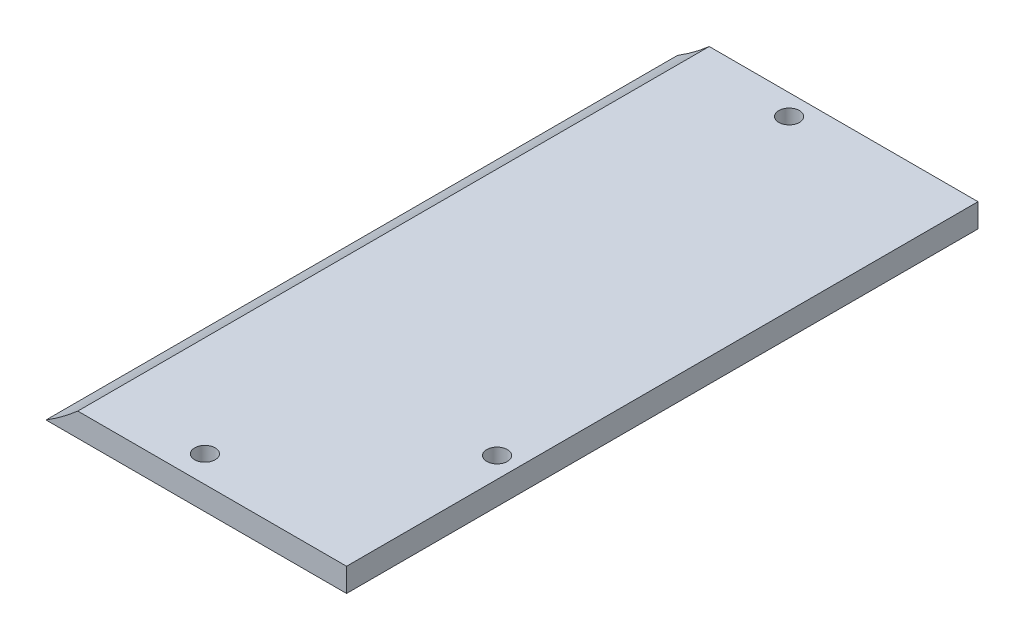
ISO-10303-21;
HEADER;
FILE_DESCRIPTION(('STEP AP214'),'2;1');
FILE_NAME('part.step','',(''),(''),'','','');
FILE_SCHEMA(('AUTOMOTIVE_DESIGN { 1 0 10303 214 1 1 1 1 }'));
ENDSEC;
DATA;
#1=APPLICATION_CONTEXT('core data for automotive mechanical design processes');
#2=APPLICATION_PROTOCOL_DEFINITION('international standard','automotive_design',2000,#1);
#3=PRODUCT_CONTEXT('',#1,'mechanical');
#4=PRODUCT('Part','Part','',(#3));
#5=PRODUCT_RELATED_PRODUCT_CATEGORY('part','',(#4));
#6=PRODUCT_DEFINITION_FORMATION('','',#4);
#7=PRODUCT_DEFINITION_CONTEXT('part definition',#1,'design');
#8=PRODUCT_DEFINITION('design','',#6,#7);
#9=PRODUCT_DEFINITION_SHAPE('','',#8);
#10=(LENGTH_UNIT() NAMED_UNIT(*) SI_UNIT(.MILLI.,.METRE.));
#11=(NAMED_UNIT(*) PLANE_ANGLE_UNIT() SI_UNIT($,.RADIAN.));
#12=(NAMED_UNIT(*) SI_UNIT($,.STERADIAN.) SOLID_ANGLE_UNIT());
#13=UNCERTAINTY_MEASURE_WITH_UNIT(LENGTH_MEASURE(1.E-05),#10,'distance_accuracy_value','');
#14=(GEOMETRIC_REPRESENTATION_CONTEXT(3) GLOBAL_UNCERTAINTY_ASSIGNED_CONTEXT((#13)) GLOBAL_UNIT_ASSIGNED_CONTEXT((#10,
#11,#12)) REPRESENTATION_CONTEXT('',''));
#15=CARTESIAN_POINT('',(0.,0.,0.));
#16=DIRECTION('',(0.,0.,1.));
#17=DIRECTION('',(1.,0.,0.));
#18=AXIS2_PLACEMENT_3D('',#15,#16,#17);
#19=CARTESIAN_POINT('',(21.0713075057055,-34.,107.));
#20=DIRECTION('',(0.,-1.,0.));
#21=DIRECTION('',(1.,0.,0.));
#22=AXIS2_PLACEMENT_3D('',#19,#20,#21);
#23=PLANE('',#22);
#24=CARTESIAN_POINT('',(68.5,-34.,78.));
#25=DIRECTION('',(0.,-1.,0.));
#26=DIRECTION('',(1.,0.,0.));
#27=AXIS2_PLACEMENT_3D('',#24,#25,#26);
#28=CIRCLE('',#27,1.75000000000001);
#29=CARTESIAN_POINT('',(70.25,-34.,78.));
#30=VERTEX_POINT('',#29);
#31=EDGE_CURVE('E113',#30,#30,#28,.T.);
#32=ORIENTED_EDGE('',*,*,#31,.F.);
#33=EDGE_LOOP('',(#32));
#34=FACE_BOUND('',#33,.T.);
#35=CARTESIAN_POINT('',(43.5,-34.,3.50000000000001));
#36=DIRECTION('',(0.,-1.,0.));
#37=DIRECTION('',(1.,0.,0.));
#38=AXIS2_PLACEMENT_3D('',#35,#36,#37);
#39=CIRCLE('',#38,1.75);
#40=CARTESIAN_POINT('',(45.25,-34.,3.50000000000001));
#41=VERTEX_POINT('',#40);
#42=EDGE_CURVE('E107',#41,#41,#39,.T.);
#43=ORIENTED_EDGE('',*,*,#42,.F.);
#44=EDGE_LOOP('',(#43));
#45=FACE_BOUND('',#44,.T.);
#46=CARTESIAN_POINT('',(43.5,-34.,102.5));
#47=DIRECTION('',(0.,-1.,0.));
#48=DIRECTION('',(1.,0.,0.));
#49=AXIS2_PLACEMENT_3D('',#46,#47,#48);
#50=CIRCLE('',#49,1.75000000000001);
#51=CARTESIAN_POINT('',(45.25,-34.,102.5));
#52=VERTEX_POINT('',#51);
#53=EDGE_CURVE('E101',#52,#52,#50,.T.);
#54=ORIENTED_EDGE('',*,*,#53,.F.);
#55=EDGE_LOOP('',(#54));
#56=FACE_BOUND('',#55,.T.);
#57=DIRECTION('',(0.,0.,-1.));
#58=VECTOR('',#57,1.);
#59=CARTESIAN_POINT('',(72.,-34.,107.));
#60=LINE('',#59,#58);
#61=CARTESIAN_POINT('',(72.,-34.,107.));
#62=VERTEX_POINT('',#61);
#63=CARTESIAN_POINT('',(72.,-34.,0.));
#64=VERTEX_POINT('',#63);
#65=EDGE_CURVE('E46',#62,#64,#60,.T.);
#66=ORIENTED_EDGE('',*,*,#65,.F.);
#67=DIRECTION('',(1.,0.,0.));
#68=VECTOR('',#67,1.);
#69=CARTESIAN_POINT('',(21.0713075057055,-34.,107.));
#70=LINE('',#69,#68);
#71=CARTESIAN_POINT('',(21.0713075057055,-34.,107.));
#72=VERTEX_POINT('',#71);
#73=EDGE_CURVE('E80',#72,#62,#70,.T.);
#74=ORIENTED_EDGE('',*,*,#73,.F.);
#75=DIRECTION('',(0.,0.,-1.));
#76=VECTOR('',#75,1.);
#77=CARTESIAN_POINT('',(21.0713075057055,-34.,107.));
#78=LINE('',#77,#76);
#79=CARTESIAN_POINT('',(21.0713075057055,-34.,0.));
#80=VERTEX_POINT('',#79);
#81=EDGE_CURVE('E11',#72,#80,#78,.T.);
#82=ORIENTED_EDGE('',*,*,#81,.T.);
#83=DIRECTION('',(-1.,0.,0.));
#84=VECTOR('',#83,1.);
#85=CARTESIAN_POINT('',(21.0713075057055,-34.,0.));
#86=LINE('',#85,#84);
#87=EDGE_CURVE('E94',#64,#80,#86,.T.);
#88=ORIENTED_EDGE('',*,*,#87,.F.);
#89=EDGE_LOOP('',(#66,#74,#82,#88));
#90=FACE_BOUND('',#89,.T.);
#91=ADVANCED_FACE('F37',(#34,#45,#56,#90),#23,.T.);
#92=CARTESIAN_POINT('',(72.,-34.,107.));
#93=DIRECTION('',(1.,0.,0.));
#94=DIRECTION('',(0.,0.,-1.));
#95=AXIS2_PLACEMENT_3D('',#92,#93,#94);
#96=PLANE('',#95);
#97=DIRECTION('',(0.,0.,-1.));
#98=VECTOR('',#97,1.);
#99=CARTESIAN_POINT('',(72.,-30.,107.));
#100=LINE('',#99,#98);
#101=CARTESIAN_POINT('',(72.,-30.,107.));
#102=VERTEX_POINT('',#101);
#103=CARTESIAN_POINT('',(72.,-30.,0.));
#104=VERTEX_POINT('',#103);
#105=EDGE_CURVE('E87',#102,#104,#100,.T.);
#106=ORIENTED_EDGE('',*,*,#105,.F.);
#107=DIRECTION('',(0.,1.,0.));
#108=VECTOR('',#107,1.);
#109=CARTESIAN_POINT('',(72.,-34.,107.));
#110=LINE('',#109,#108);
#111=EDGE_CURVE('E77',#62,#102,#110,.T.);
#112=ORIENTED_EDGE('',*,*,#111,.F.);
#113=ORIENTED_EDGE('',*,*,#65,.T.);
#114=DIRECTION('',(0.,-1.,0.));
#115=VECTOR('',#114,1.);
#116=CARTESIAN_POINT('',(72.,-34.,0.));
#117=LINE('',#116,#115);
#118=EDGE_CURVE('E91',#104,#64,#117,.T.);
#119=ORIENTED_EDGE('',*,*,#118,.F.);
#120=EDGE_LOOP('',(#106,#112,#113,#119));
#121=FACE_BOUND('',#120,.T.);
#122=ADVANCED_FACE('F90',(#121),#96,.T.);
#123=CARTESIAN_POINT('',(72.,-30.,107.));
#124=DIRECTION('',(0.,1.,0.));
#125=DIRECTION('',(0.,0.,1.));
#126=AXIS2_PLACEMENT_3D('',#123,#124,#125);
#127=PLANE('',#126);
#128=CARTESIAN_POINT('',(68.5,-30.,78.));
#129=DIRECTION('',(0.,1.,0.));
#130=DIRECTION('',(0.,0.,1.));
#131=AXIS2_PLACEMENT_3D('',#128,#129,#130);
#132=CIRCLE('',#131,1.75000000000001);
#133=CARTESIAN_POINT('',(68.5,-30.,79.75));
#134=VERTEX_POINT('',#133);
#135=EDGE_CURVE('E116',#134,#134,#132,.T.);
#136=ORIENTED_EDGE('',*,*,#135,.F.);
#137=EDGE_LOOP('',(#136));
#138=FACE_BOUND('',#137,.T.);
#139=CARTESIAN_POINT('',(43.5,-30.,3.50000000000001));
#140=DIRECTION('',(0.,1.,0.));
#141=DIRECTION('',(0.,0.,1.));
#142=AXIS2_PLACEMENT_3D('',#139,#140,#141);
#143=CIRCLE('',#142,1.75);
#144=CARTESIAN_POINT('',(43.5,-30.,5.25000000000001));
#145=VERTEX_POINT('',#144);
#146=EDGE_CURVE('E110',#145,#145,#143,.T.);
#147=ORIENTED_EDGE('',*,*,#146,.F.);
#148=EDGE_LOOP('',(#147));
#149=FACE_BOUND('',#148,.T.);
#150=CARTESIAN_POINT('',(43.5,-30.,102.5));
#151=DIRECTION('',(0.,1.,0.));
#152=DIRECTION('',(0.,0.,1.));
#153=AXIS2_PLACEMENT_3D('',#150,#151,#152);
#154=CIRCLE('',#153,1.75000000000001);
#155=CARTESIAN_POINT('',(43.5,-30.,104.25));
#156=VERTEX_POINT('',#155);
#157=EDGE_CURVE('E104',#156,#156,#154,.T.);
#158=ORIENTED_EDGE('',*,*,#157,.F.);
#159=EDGE_LOOP('',(#158));
#160=FACE_BOUND('',#159,.T.);
#161=DIRECTION('',(0.,0.,-1.));
#162=VECTOR('',#161,1.);
#163=CARTESIAN_POINT('',(26.4575131106459,-30.,107.));
#164=LINE('',#163,#162);
#165=CARTESIAN_POINT('',(26.4575131106459,-30.,107.));
#166=VERTEX_POINT('',#165);
#167=CARTESIAN_POINT('',(26.4575131106459,-30.,0.));
#168=VERTEX_POINT('',#167);
#169=EDGE_CURVE('E41',#166,#168,#164,.T.);
#170=ORIENTED_EDGE('',*,*,#169,.F.);
#171=DIRECTION('',(-1.,0.,0.));
#172=VECTOR('',#171,1.);
#173=CARTESIAN_POINT('',(72.,-30.,107.));
#174=LINE('',#173,#172);
#175=EDGE_CURVE('E54',#102,#166,#174,.T.);
#176=ORIENTED_EDGE('',*,*,#175,.F.);
#177=ORIENTED_EDGE('',*,*,#105,.T.);
#178=DIRECTION('',(1.,0.,0.));
#179=VECTOR('',#178,1.);
#180=CARTESIAN_POINT('',(72.,-30.,0.));
#181=LINE('',#180,#179);
#182=EDGE_CURVE('E99',#168,#104,#181,.T.);
#183=ORIENTED_EDGE('',*,*,#182,.F.);
#184=EDGE_LOOP('',(#170,#176,#177,#183));
#185=FACE_BOUND('',#184,.T.);
#186=ADVANCED_FACE('F85',(#138,#149,#160,#185),#127,.T.);
#187=CARTESIAN_POINT('',(0.,0.,-2.001));
#188=DIRECTION('',(0.,0.,1.));
#189=DIRECTION('',(1.,0.,0.));
#190=AXIS2_PLACEMENT_3D('',#187,#188,#189);
#191=CYLINDRICAL_SURFACE('',#190,40.);
#192=CARTESIAN_POINT('',(0.,0.,107.));
#193=DIRECTION('',(0.,0.,-1.));
#194=DIRECTION('',(1.,0.,0.));
#195=AXIS2_PLACEMENT_3D('',#192,#193,#194);
#196=CIRCLE('',#195,40.);
#197=EDGE_CURVE('E88',#166,#72,#196,.T.);
#198=ORIENTED_EDGE('',*,*,#197,.F.);
#199=ORIENTED_EDGE('',*,*,#169,.T.);
#200=CARTESIAN_POINT('',(0.,0.,0.));
#201=DIRECTION('',(0.,0.,1.));
#202=DIRECTION('',(1.,0.,0.));
#203=AXIS2_PLACEMENT_3D('',#200,#201,#202);
#204=CIRCLE('',#203,40.);
#205=EDGE_CURVE('E119',#80,#168,#204,.T.);
#206=ORIENTED_EDGE('',*,*,#205,.F.);
#207=ORIENTED_EDGE('',*,*,#81,.F.);
#208=EDGE_LOOP('',(#198,#199,#206,#207));
#209=FACE_BOUND('',#208,.T.);
#210=ADVANCED_FACE('F128',(#209),#191,.F.);
#211=CARTESIAN_POINT('',(0.,0.,0.));
#212=DIRECTION('',(0.,0.,1.));
#213=DIRECTION('',(1.,0.,0.));
#214=AXIS2_PLACEMENT_3D('',#211,#212,#213);
#215=PLANE('',#214);
#216=ORIENTED_EDGE('',*,*,#87,.T.);
#217=ORIENTED_EDGE('',*,*,#205,.T.);
#218=ORIENTED_EDGE('',*,*,#182,.T.);
#219=ORIENTED_EDGE('',*,*,#118,.T.);
#220=EDGE_LOOP('',(#216,#217,#218,#219));
#221=FACE_BOUND('',#220,.T.);
#222=ADVANCED_FACE('F39',(#221),#215,.F.);
#223=CARTESIAN_POINT('',(43.5,-40.,102.5));
#224=DIRECTION('',(0.,1.,0.));
#225=DIRECTION('',(0.,0.,1.));
#226=AXIS2_PLACEMENT_3D('',#223,#224,#225);
#227=CYLINDRICAL_SURFACE('',#226,1.75000000000001);
#228=ORIENTED_EDGE('',*,*,#53,.T.);
#229=EDGE_LOOP('',(#228));
#230=FACE_BOUND('',#229,.T.);
#231=ORIENTED_EDGE('',*,*,#157,.T.);
#232=EDGE_LOOP('',(#231));
#233=FACE_BOUND('',#232,.T.);
#234=ADVANCED_FACE('F131',(#230,#233),#227,.F.);
#235=CARTESIAN_POINT('',(43.5,-40.,3.50000000000001));
#236=DIRECTION('',(0.,1.,0.));
#237=DIRECTION('',(0.,0.,1.));
#238=AXIS2_PLACEMENT_3D('',#235,#236,#237);
#239=CYLINDRICAL_SURFACE('',#238,1.75);
#240=ORIENTED_EDGE('',*,*,#42,.T.);
#241=EDGE_LOOP('',(#240));
#242=FACE_BOUND('',#241,.T.);
#243=ORIENTED_EDGE('',*,*,#146,.T.);
#244=EDGE_LOOP('',(#243));
#245=FACE_BOUND('',#244,.T.);
#246=ADVANCED_FACE('F136',(#242,#245),#239,.F.);
#247=CARTESIAN_POINT('',(68.5,-40.,78.));
#248=DIRECTION('',(0.,1.,0.));
#249=DIRECTION('',(0.,0.,1.));
#250=AXIS2_PLACEMENT_3D('',#247,#248,#249);
#251=CYLINDRICAL_SURFACE('',#250,1.75000000000001);
#252=ORIENTED_EDGE('',*,*,#31,.T.);
#253=EDGE_LOOP('',(#252));
#254=FACE_BOUND('',#253,.T.);
#255=ORIENTED_EDGE('',*,*,#135,.T.);
#256=EDGE_LOOP('',(#255));
#257=FACE_BOUND('',#256,.T.);
#258=ADVANCED_FACE('F162',(#254,#257),#251,.F.);
#259=CARTESIAN_POINT('',(0.,0.,107.));
#260=DIRECTION('',(0.,0.,1.));
#261=DIRECTION('',(1.,0.,0.));
#262=AXIS2_PLACEMENT_3D('',#259,#260,#261);
#263=PLANE('',#262);
#264=ORIENTED_EDGE('',*,*,#111,.T.);
#265=ORIENTED_EDGE('',*,*,#175,.T.);
#266=ORIENTED_EDGE('',*,*,#197,.T.);
#267=ORIENTED_EDGE('',*,*,#73,.T.);
#268=EDGE_LOOP('',(#264,#265,#266,#267));
#269=FACE_BOUND('',#268,.T.);
#270=ADVANCED_FACE('F78',(#269),#263,.T.);
#271=CLOSED_SHELL('',(#91,#122,#186,#210,#222,#234,#246,#258,#270));
#272=MANIFOLD_SOLID_BREP('B2',#271);
#273=ADVANCED_BREP_SHAPE_REPRESENTATION('',(#18,#272),#14);
#274=SHAPE_DEFINITION_REPRESENTATION(#9,#273);
ENDSEC;
END-ISO-10303-21;
